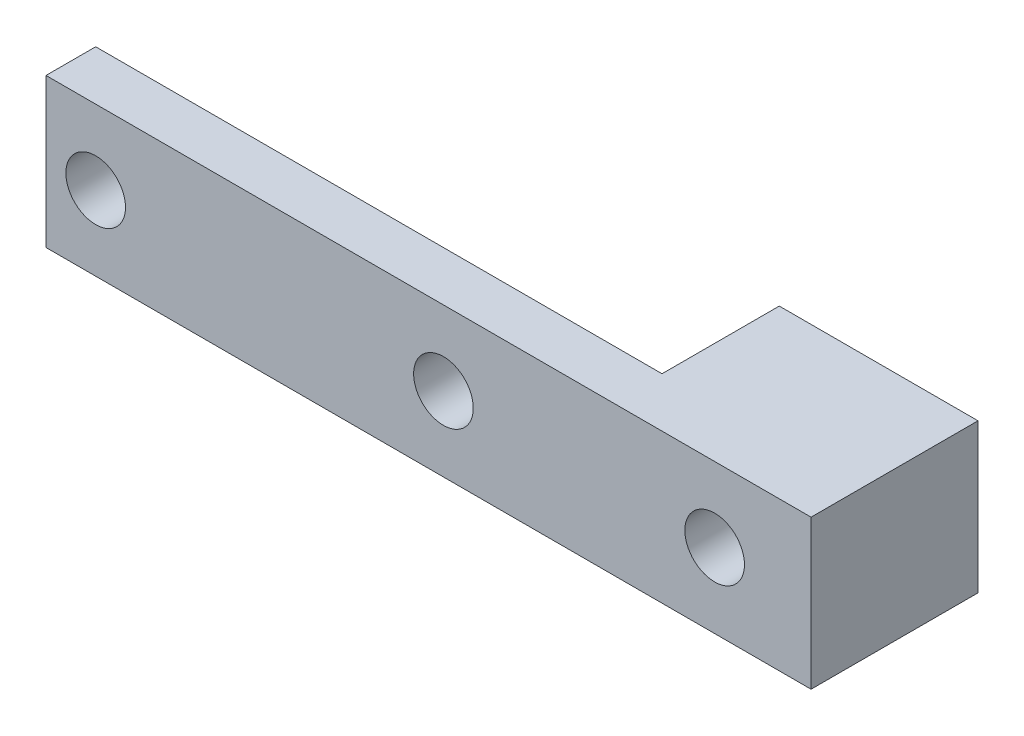
ISO-10303-21;
HEADER;
FILE_DESCRIPTION(('STEP AP214'),'2;1');
FILE_NAME('part.step','',(''),(''),'','','');
FILE_SCHEMA(('AUTOMOTIVE_DESIGN { 1 0 10303 214 1 1 1 1 }'));
ENDSEC;
DATA;
#1=APPLICATION_CONTEXT('core data for automotive mechanical design processes');
#2=APPLICATION_PROTOCOL_DEFINITION('international standard','automotive_design',2000,#1);
#3=PRODUCT_CONTEXT('',#1,'mechanical');
#4=PRODUCT('Part','Part','',(#3));
#5=PRODUCT_RELATED_PRODUCT_CATEGORY('part','',(#4));
#6=PRODUCT_DEFINITION_FORMATION('','',#4);
#7=PRODUCT_DEFINITION_CONTEXT('part definition',#1,'design');
#8=PRODUCT_DEFINITION('design','',#6,#7);
#9=PRODUCT_DEFINITION_SHAPE('','',#8);
#10=(LENGTH_UNIT() NAMED_UNIT(*) SI_UNIT(.MILLI.,.METRE.));
#11=(NAMED_UNIT(*) PLANE_ANGLE_UNIT() SI_UNIT($,.RADIAN.));
#12=(NAMED_UNIT(*) SI_UNIT($,.STERADIAN.) SOLID_ANGLE_UNIT());
#13=UNCERTAINTY_MEASURE_WITH_UNIT(LENGTH_MEASURE(1.E-05),#10,'distance_accuracy_value','');
#14=(GEOMETRIC_REPRESENTATION_CONTEXT(3) GLOBAL_UNCERTAINTY_ASSIGNED_CONTEXT((#13)) GLOBAL_UNIT_ASSIGNED_CONTEXT((#10,
#11,#12)) REPRESENTATION_CONTEXT('',''));
#15=CARTESIAN_POINT('',(0.,0.,0.));
#16=DIRECTION('',(0.,0.,1.));
#17=DIRECTION('',(1.,0.,0.));
#18=AXIS2_PLACEMENT_3D('',#15,#16,#17);
#19=CARTESIAN_POINT('',(0.,0.,0.));
#20=DIRECTION('',(0.,0.,1.));
#21=DIRECTION('',(1.,0.,0.));
#22=AXIS2_PLACEMENT_3D('',#19,#20,#21);
#23=PLANE('',#22);
#24=CARTESIAN_POINT('',(0.750000000000001,0.,0.));
#25=DIRECTION('',(0.,0.,1.));
#26=DIRECTION('',(1.,0.,0.));
#27=AXIS2_PLACEMENT_3D('',#24,#25,#26);
#28=CIRCLE('',#27,1.5);
#29=CARTESIAN_POINT('',(2.25,0.,0.));
#30=VERTEX_POINT('',#29);
#31=EDGE_CURVE('E133',#30,#30,#28,.T.);
#32=ORIENTED_EDGE('',*,*,#31,.T.);
#33=EDGE_LOOP('',(#32));
#34=FACE_BOUND('',#33,.T.);
#35=CARTESIAN_POINT('',(-16.75,0.,0.));
#36=DIRECTION('',(0.,0.,1.));
#37=DIRECTION('',(1.,0.,0.));
#38=AXIS2_PLACEMENT_3D('',#35,#36,#37);
#39=CIRCLE('',#38,1.5);
#40=CARTESIAN_POINT('',(-15.25,0.,0.));
#41=VERTEX_POINT('',#40);
#42=EDGE_CURVE('E121',#41,#41,#39,.T.);
#43=ORIENTED_EDGE('',*,*,#42,.T.);
#44=EDGE_LOOP('',(#43));
#45=FACE_BOUND('',#44,.T.);
#46=DIRECTION('',(0.,1.,0.));
#47=VECTOR('',#46,1.);
#48=CARTESIAN_POINT('',(9.25,-3.75,0.));
#49=LINE('',#48,#47);
#50=CARTESIAN_POINT('',(9.25,-3.75,0.));
#51=VERTEX_POINT('',#50);
#52=CARTESIAN_POINT('',(9.25,3.75,0.));
#53=VERTEX_POINT('',#52);
#54=EDGE_CURVE('E56',#51,#53,#49,.T.);
#55=ORIENTED_EDGE('',*,*,#54,.F.);
#56=DIRECTION('',(-1.,0.,0.));
#57=VECTOR('',#56,1.);
#58=CARTESIAN_POINT('',(0.,-3.75,0.));
#59=LINE('',#58,#57);
#60=CARTESIAN_POINT('',(-19.25,-3.75,0.));
#61=VERTEX_POINT('',#60);
#62=EDGE_CURVE('E78',#51,#61,#59,.T.);
#63=ORIENTED_EDGE('',*,*,#62,.T.);
#64=DIRECTION('',(0.,1.,0.));
#65=VECTOR('',#64,1.);
#66=CARTESIAN_POINT('',(-19.25,0.,0.));
#67=LINE('',#66,#65);
#68=CARTESIAN_POINT('',(-19.25,3.75,0.));
#69=VERTEX_POINT('',#68);
#70=EDGE_CURVE('E148',#61,#69,#67,.T.);
#71=ORIENTED_EDGE('',*,*,#70,.T.);
#72=DIRECTION('',(-1.,0.,0.));
#73=VECTOR('',#72,1.);
#74=CARTESIAN_POINT('',(0.,3.75,0.));
#75=LINE('',#74,#73);
#76=EDGE_CURVE('E124',#53,#69,#75,.T.);
#77=ORIENTED_EDGE('',*,*,#76,.F.);
#78=EDGE_LOOP('',(#55,#63,#71,#77));
#79=FACE_BOUND('',#78,.T.);
#80=ADVANCED_FACE('F41',(#34,#45,#79),#23,.F.);
#81=CARTESIAN_POINT('',(19.25,0.,2.5));
#82=DIRECTION('',(-1.,0.,0.));
#83=DIRECTION('',(0.,0.,1.));
#84=AXIS2_PLACEMENT_3D('',#81,#82,#83);
#85=PLANE('',#84);
#86=DIRECTION('',(0.,0.,-1.));
#87=VECTOR('',#86,1.);
#88=CARTESIAN_POINT('',(19.25,-3.75,2.5));
#89=LINE('',#88,#87);
#90=CARTESIAN_POINT('',(19.25,-3.75,2.5));
#91=VERTEX_POINT('',#90);
#92=CARTESIAN_POINT('',(19.25,-3.75,-5.9));
#93=VERTEX_POINT('',#92);
#94=EDGE_CURVE('E65',#91,#93,#89,.T.);
#95=ORIENTED_EDGE('',*,*,#94,.T.);
#96=DIRECTION('',(0.,-1.,0.));
#97=VECTOR('',#96,1.);
#98=CARTESIAN_POINT('',(19.25,-3.75,-5.9));
#99=LINE('',#98,#97);
#100=CARTESIAN_POINT('',(19.25,3.75,-5.9));
#101=VERTEX_POINT('',#100);
#102=EDGE_CURVE('E118',#101,#93,#99,.T.);
#103=ORIENTED_EDGE('',*,*,#102,.F.);
#104=DIRECTION('',(0.,0.,-1.));
#105=VECTOR('',#104,1.);
#106=CARTESIAN_POINT('',(19.25,3.75,2.5));
#107=LINE('',#106,#105);
#108=CARTESIAN_POINT('',(19.25,3.75,2.5));
#109=VERTEX_POINT('',#108);
#110=EDGE_CURVE('E11',#109,#101,#107,.T.);
#111=ORIENTED_EDGE('',*,*,#110,.F.);
#112=DIRECTION('',(0.,1.,0.));
#113=VECTOR('',#112,1.);
#114=CARTESIAN_POINT('',(19.25,0.,2.5));
#115=LINE('',#114,#113);
#116=EDGE_CURVE('E132',#91,#109,#115,.T.);
#117=ORIENTED_EDGE('',*,*,#116,.F.);
#118=EDGE_LOOP('',(#95,#103,#111,#117));
#119=FACE_BOUND('',#118,.T.);
#120=ADVANCED_FACE('F183',(#119),#85,.F.);
#121=CARTESIAN_POINT('',(0.,3.75,2.5));
#122=DIRECTION('',(0.,-1.,0.));
#123=DIRECTION('',(0.,0.,-1.));
#124=AXIS2_PLACEMENT_3D('',#121,#122,#123);
#125=PLANE('',#124);
#126=ORIENTED_EDGE('',*,*,#110,.T.);
#127=DIRECTION('',(1.,0.,0.));
#128=VECTOR('',#127,1.);
#129=CARTESIAN_POINT('',(19.25,3.75,-5.9));
#130=LINE('',#129,#128);
#131=CARTESIAN_POINT('',(9.25,3.75,-5.9));
#132=VERTEX_POINT('',#131);
#133=EDGE_CURVE('E111',#132,#101,#130,.T.);
#134=ORIENTED_EDGE('',*,*,#133,.F.);
#135=DIRECTION('',(0.,0.,1.));
#136=VECTOR('',#135,1.);
#137=CARTESIAN_POINT('',(9.25,3.75,-5.9));
#138=LINE('',#137,#136);
#139=EDGE_CURVE('E107',#132,#53,#138,.T.);
#140=ORIENTED_EDGE('',*,*,#139,.T.);
#141=ORIENTED_EDGE('',*,*,#76,.T.);
#142=DIRECTION('',(0.,0.,-1.));
#143=VECTOR('',#142,1.);
#144=CARTESIAN_POINT('',(-19.25,3.75,2.5));
#145=LINE('',#144,#143);
#146=CARTESIAN_POINT('',(-19.25,3.75,2.5));
#147=VERTEX_POINT('',#146);
#148=EDGE_CURVE('E49',#147,#69,#145,.T.);
#149=ORIENTED_EDGE('',*,*,#148,.F.);
#150=DIRECTION('',(-1.,0.,0.));
#151=VECTOR('',#150,1.);
#152=CARTESIAN_POINT('',(0.,3.75,2.5));
#153=LINE('',#152,#151);
#154=EDGE_CURVE('E85',#109,#147,#153,.T.);
#155=ORIENTED_EDGE('',*,*,#154,.F.);
#156=EDGE_LOOP('',(#126,#134,#140,#141,#149,#155));
#157=FACE_BOUND('',#156,.T.);
#158=ADVANCED_FACE('F161',(#157),#125,.F.);
#159=CARTESIAN_POINT('',(-19.25,0.,2.5));
#160=DIRECTION('',(-1.,0.,0.));
#161=DIRECTION('',(0.,0.,1.));
#162=AXIS2_PLACEMENT_3D('',#159,#160,#161);
#163=PLANE('',#162);
#164=ORIENTED_EDGE('',*,*,#70,.F.);
#165=DIRECTION('',(0.,0.,-1.));
#166=VECTOR('',#165,1.);
#167=CARTESIAN_POINT('',(-19.25,-3.75,2.5));
#168=LINE('',#167,#166);
#169=CARTESIAN_POINT('',(-19.25,-3.75,2.5));
#170=VERTEX_POINT('',#169);
#171=EDGE_CURVE('E154',#170,#61,#168,.T.);
#172=ORIENTED_EDGE('',*,*,#171,.F.);
#173=DIRECTION('',(0.,1.,0.));
#174=VECTOR('',#173,1.);
#175=CARTESIAN_POINT('',(-19.25,0.,2.5));
#176=LINE('',#175,#174);
#177=EDGE_CURVE('E136',#170,#147,#176,.T.);
#178=ORIENTED_EDGE('',*,*,#177,.T.);
#179=ORIENTED_EDGE('',*,*,#148,.T.);
#180=EDGE_LOOP('',(#164,#172,#178,#179));
#181=FACE_BOUND('',#180,.T.);
#182=ADVANCED_FACE('F158',(#181),#163,.T.);
#183=CARTESIAN_POINT('',(14.398,0.,2.5));
#184=DIRECTION('',(0.,0.,-1.));
#185=DIRECTION('',(-1.,0.,0.));
#186=AXIS2_PLACEMENT_3D('',#183,#184,#185);
#187=CYLINDRICAL_SURFACE('',#186,1.5);
#188=CARTESIAN_POINT('',(14.398,0.,2.5));
#189=DIRECTION('',(0.,0.,1.));
#190=DIRECTION('',(1.,0.,0.));
#191=AXIS2_PLACEMENT_3D('',#188,#189,#190);
#192=CIRCLE('',#191,1.5);
#193=CARTESIAN_POINT('',(15.898,0.,2.5));
#194=VERTEX_POINT('',#193);
#195=EDGE_CURVE('E141',#194,#194,#192,.T.);
#196=ORIENTED_EDGE('',*,*,#195,.T.);
#197=EDGE_LOOP('',(#196));
#198=FACE_BOUND('',#197,.T.);
#199=CARTESIAN_POINT('',(14.398,0.,-5.9));
#200=DIRECTION('',(0.,0.,-1.));
#201=DIRECTION('',(-1.,0.,0.));
#202=AXIS2_PLACEMENT_3D('',#199,#200,#201);
#203=CIRCLE('',#202,1.5);
#204=CARTESIAN_POINT('',(12.898,0.,-5.9));
#205=VERTEX_POINT('',#204);
#206=EDGE_CURVE('E160',#205,#205,#203,.T.);
#207=ORIENTED_EDGE('',*,*,#206,.T.);
#208=EDGE_LOOP('',(#207));
#209=FACE_BOUND('',#208,.T.);
#210=ADVANCED_FACE('F169',(#198,#209),#187,.F.);
#211=CARTESIAN_POINT('',(0.,-3.75,2.5));
#212=DIRECTION('',(0.,-1.,0.));
#213=DIRECTION('',(0.,0.,-1.));
#214=AXIS2_PLACEMENT_3D('',#211,#212,#213);
#215=PLANE('',#214);
#216=ORIENTED_EDGE('',*,*,#62,.F.);
#217=DIRECTION('',(0.,0.,1.));
#218=VECTOR('',#217,1.);
#219=CARTESIAN_POINT('',(9.25,-3.75,-5.9));
#220=LINE('',#219,#218);
#221=CARTESIAN_POINT('',(9.25,-3.75,-5.9));
#222=VERTEX_POINT('',#221);
#223=EDGE_CURVE('E105',#222,#51,#220,.T.);
#224=ORIENTED_EDGE('',*,*,#223,.F.);
#225=DIRECTION('',(-1.,0.,0.));
#226=VECTOR('',#225,1.);
#227=CARTESIAN_POINT('',(9.25,-3.75,-5.9));
#228=LINE('',#227,#226);
#229=EDGE_CURVE('E112',#93,#222,#228,.T.);
#230=ORIENTED_EDGE('',*,*,#229,.F.);
#231=ORIENTED_EDGE('',*,*,#94,.F.);
#232=DIRECTION('',(-1.,0.,0.));
#233=VECTOR('',#232,1.);
#234=CARTESIAN_POINT('',(0.,-3.75,2.5));
#235=LINE('',#234,#233);
#236=EDGE_CURVE('E139',#91,#170,#235,.T.);
#237=ORIENTED_EDGE('',*,*,#236,.T.);
#238=ORIENTED_EDGE('',*,*,#171,.T.);
#239=EDGE_LOOP('',(#216,#224,#230,#231,#237,#238));
#240=FACE_BOUND('',#239,.T.);
#241=ADVANCED_FACE('F120',(#240),#215,.T.);
#242=CARTESIAN_POINT('',(-16.75,0.,2.5));
#243=DIRECTION('',(0.,0.,-1.));
#244=DIRECTION('',(-1.,0.,0.));
#245=AXIS2_PLACEMENT_3D('',#242,#243,#244);
#246=CYLINDRICAL_SURFACE('',#245,1.5);
#247=CARTESIAN_POINT('',(-16.75,0.,2.5));
#248=DIRECTION('',(0.,0.,1.));
#249=DIRECTION('',(1.,0.,0.));
#250=AXIS2_PLACEMENT_3D('',#247,#248,#249);
#251=CIRCLE('',#250,1.5);
#252=CARTESIAN_POINT('',(-15.25,0.,2.5));
#253=VERTEX_POINT('',#252);
#254=EDGE_CURVE('E129',#253,#253,#251,.T.);
#255=ORIENTED_EDGE('',*,*,#254,.T.);
#256=EDGE_LOOP('',(#255));
#257=FACE_BOUND('',#256,.T.);
#258=ORIENTED_EDGE('',*,*,#42,.F.);
#259=EDGE_LOOP('',(#258));
#260=FACE_BOUND('',#259,.T.);
#261=ADVANCED_FACE('F43',(#257,#260),#246,.F.);
#262=CARTESIAN_POINT('',(0.750000000000001,0.,2.5));
#263=DIRECTION('',(0.,0.,-1.));
#264=DIRECTION('',(-1.,0.,0.));
#265=AXIS2_PLACEMENT_3D('',#262,#263,#264);
#266=CYLINDRICAL_SURFACE('',#265,1.5);
#267=CARTESIAN_POINT('',(0.750000000000001,0.,2.5));
#268=DIRECTION('',(0.,0.,1.));
#269=DIRECTION('',(1.,0.,0.));
#270=AXIS2_PLACEMENT_3D('',#267,#268,#269);
#271=CIRCLE('',#270,1.5);
#272=CARTESIAN_POINT('',(2.25,0.,2.5));
#273=VERTEX_POINT('',#272);
#274=EDGE_CURVE('E144',#273,#273,#271,.T.);
#275=ORIENTED_EDGE('',*,*,#274,.T.);
#276=EDGE_LOOP('',(#275));
#277=FACE_BOUND('',#276,.T.);
#278=ORIENTED_EDGE('',*,*,#31,.F.);
#279=EDGE_LOOP('',(#278));
#280=FACE_BOUND('',#279,.T.);
#281=ADVANCED_FACE('F179',(#277,#280),#266,.F.);
#282=CARTESIAN_POINT('',(0.,0.,2.5));
#283=DIRECTION('',(0.,0.,1.));
#284=DIRECTION('',(1.,0.,0.));
#285=AXIS2_PLACEMENT_3D('',#282,#283,#284);
#286=PLANE('',#285);
#287=ORIENTED_EDGE('',*,*,#254,.F.);
#288=EDGE_LOOP('',(#287));
#289=FACE_BOUND('',#288,.T.);
#290=ORIENTED_EDGE('',*,*,#116,.T.);
#291=ORIENTED_EDGE('',*,*,#154,.T.);
#292=ORIENTED_EDGE('',*,*,#177,.F.);
#293=ORIENTED_EDGE('',*,*,#236,.F.);
#294=EDGE_LOOP('',(#290,#291,#292,#293));
#295=FACE_BOUND('',#294,.T.);
#296=ORIENTED_EDGE('',*,*,#195,.F.);
#297=EDGE_LOOP('',(#296));
#298=FACE_BOUND('',#297,.T.);
#299=ORIENTED_EDGE('',*,*,#274,.F.);
#300=EDGE_LOOP('',(#299));
#301=FACE_BOUND('',#300,.T.);
#302=ADVANCED_FACE('F171',(#289,#295,#298,#301),#286,.T.);
#303=CARTESIAN_POINT('',(0.,0.,-5.9));
#304=DIRECTION('',(0.,0.,1.));
#305=DIRECTION('',(1.,0.,0.));
#306=AXIS2_PLACEMENT_3D('',#303,#304,#305);
#307=PLANE('',#306);
#308=ORIENTED_EDGE('',*,*,#229,.T.);
#309=DIRECTION('',(0.,1.,0.));
#310=VECTOR('',#309,1.);
#311=CARTESIAN_POINT('',(9.25,-3.75,-5.9));
#312=LINE('',#311,#310);
#313=EDGE_CURVE('E101',#222,#132,#312,.T.);
#314=ORIENTED_EDGE('',*,*,#313,.T.);
#315=ORIENTED_EDGE('',*,*,#133,.T.);
#316=ORIENTED_EDGE('',*,*,#102,.T.);
#317=EDGE_LOOP('',(#308,#314,#315,#316));
#318=FACE_BOUND('',#317,.T.);
#319=ORIENTED_EDGE('',*,*,#206,.F.);
#320=EDGE_LOOP('',(#319));
#321=FACE_BOUND('',#320,.T.);
#322=ADVANCED_FACE('F115',(#318,#321),#307,.F.);
#323=CARTESIAN_POINT('',(9.25,-3.75,-5.9));
#324=DIRECTION('',(1.,0.,0.));
#325=DIRECTION('',(0.,1.,0.));
#326=AXIS2_PLACEMENT_3D('',#323,#324,#325);
#327=PLANE('',#326);
#328=ORIENTED_EDGE('',*,*,#54,.T.);
#329=ORIENTED_EDGE('',*,*,#139,.F.);
#330=ORIENTED_EDGE('',*,*,#313,.F.);
#331=ORIENTED_EDGE('',*,*,#223,.T.);
#332=EDGE_LOOP('',(#328,#329,#330,#331));
#333=FACE_BOUND('',#332,.T.);
#334=ADVANCED_FACE('F103',(#333),#327,.F.);
#335=CLOSED_SHELL('',(#80,#120,#158,#182,#210,#241,#261,#281,#302,#322,#334));
#336=MANIFOLD_SOLID_BREP('B2',#335);
#337=ADVANCED_BREP_SHAPE_REPRESENTATION('',(#18,#336),#14);
#338=SHAPE_DEFINITION_REPRESENTATION(#9,#337);
ENDSEC;
END-ISO-10303-21;
